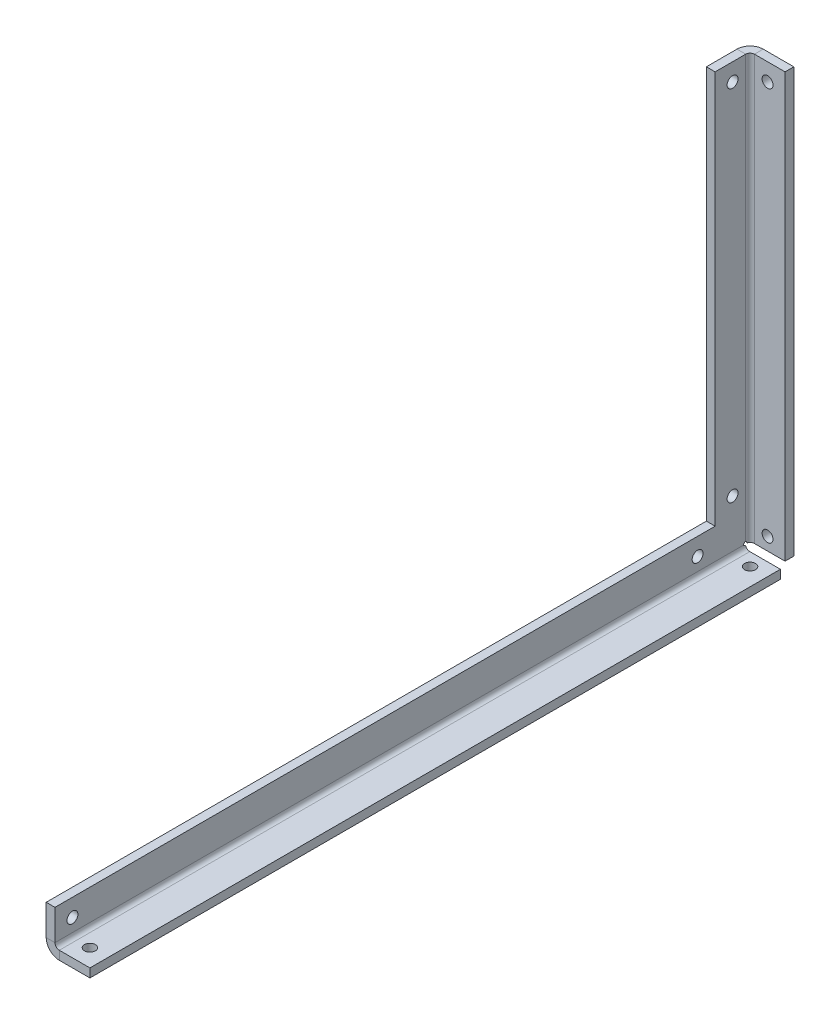
ISO-10303-21;
HEADER;
FILE_DESCRIPTION(('STEP AP214'),'2;1');
FILE_NAME('part.step','',(''),(''),'','','');
FILE_SCHEMA(('AUTOMOTIVE_DESIGN { 1 0 10303 214 1 1 1 1 }'));
ENDSEC;
DATA;
#1=APPLICATION_CONTEXT('core data for automotive mechanical design processes');
#2=APPLICATION_PROTOCOL_DEFINITION('international standard','automotive_design',2000,#1);
#3=PRODUCT_CONTEXT('',#1,'mechanical');
#4=PRODUCT('Part','Part','',(#3));
#5=PRODUCT_RELATED_PRODUCT_CATEGORY('part','',(#4));
#6=PRODUCT_DEFINITION_FORMATION('','',#4);
#7=PRODUCT_DEFINITION_CONTEXT('part definition',#1,'design');
#8=PRODUCT_DEFINITION('design','',#6,#7);
#9=PRODUCT_DEFINITION_SHAPE('','',#8);
#10=(LENGTH_UNIT() NAMED_UNIT(*) SI_UNIT(.MILLI.,.METRE.));
#11=(NAMED_UNIT(*) PLANE_ANGLE_UNIT() SI_UNIT($,.RADIAN.));
#12=(NAMED_UNIT(*) SI_UNIT($,.STERADIAN.) SOLID_ANGLE_UNIT());
#13=UNCERTAINTY_MEASURE_WITH_UNIT(LENGTH_MEASURE(1.E-05),#10,'distance_accuracy_value','');
#14=(GEOMETRIC_REPRESENTATION_CONTEXT(3) GLOBAL_UNCERTAINTY_ASSIGNED_CONTEXT((#13)) GLOBAL_UNIT_ASSIGNED_CONTEXT((#10,
#11,#12)) REPRESENTATION_CONTEXT('',''));
#15=CARTESIAN_POINT('',(0.,0.,0.));
#16=DIRECTION('',(0.,0.,1.));
#17=DIRECTION('',(1.,0.,0.));
#18=AXIS2_PLACEMENT_3D('',#15,#16,#17);
#19=CARTESIAN_POINT('',(2.,0.,0.));
#20=DIRECTION('',(1.,0.,0.));
#21=DIRECTION('',(0.,0.,-1.));
#22=AXIS2_PLACEMENT_3D('',#19,#20,#21);
#23=PLANE('',#22);
#24=CARTESIAN_POINT('',(2.,86.,-4.));
#25=DIRECTION('',(1.,0.,0.));
#26=DIRECTION('',(0.,0.,-1.));
#27=AXIS2_PLACEMENT_3D('',#24,#25,#26);
#28=CIRCLE('',#27,1.24999999999999);
#29=CARTESIAN_POINT('',(2.,86.,-5.24999999999999));
#30=VERTEX_POINT('',#29);
#31=EDGE_CURVE('E743',#30,#30,#28,.T.);
#32=ORIENTED_EDGE('',*,*,#31,.F.);
#33=EDGE_LOOP('',(#32));
#34=FACE_BOUND('',#33,.T.);
#35=CARTESIAN_POINT('',(2.,3.99999999999999,-4.));
#36=DIRECTION('',(1.,0.,0.));
#37=DIRECTION('',(0.,0.,-1.));
#38=AXIS2_PLACEMENT_3D('',#35,#36,#37);
#39=CIRCLE('',#38,1.24999999999999);
#40=CARTESIAN_POINT('',(2.,3.99999999999999,-5.24999999999999));
#41=VERTEX_POINT('',#40);
#42=EDGE_CURVE('E731',#41,#41,#39,.T.);
#43=ORIENTED_EDGE('',*,*,#42,.F.);
#44=EDGE_LOOP('',(#43));
#45=FACE_BOUND('',#44,.T.);
#46=CARTESIAN_POINT('',(2.,-4.,147.));
#47=DIRECTION('',(1.,0.,0.));
#48=DIRECTION('',(0.,0.,-1.));
#49=AXIS2_PLACEMENT_3D('',#46,#47,#48);
#50=CIRCLE('',#49,1.24999999999999);
#51=CARTESIAN_POINT('',(2.,-4.,145.75));
#52=VERTEX_POINT('',#51);
#53=EDGE_CURVE('E730',#52,#52,#50,.T.);
#54=ORIENTED_EDGE('',*,*,#53,.F.);
#55=EDGE_LOOP('',(#54));
#56=FACE_BOUND('',#55,.T.);
#57=CARTESIAN_POINT('',(2.,-4.,4.));
#58=DIRECTION('',(1.,0.,0.));
#59=DIRECTION('',(0.,0.,-1.));
#60=AXIS2_PLACEMENT_3D('',#57,#58,#59);
#61=CIRCLE('',#60,1.24999999999999);
#62=CARTESIAN_POINT('',(2.,-4.,2.75000000000002));
#63=VERTEX_POINT('',#62);
#64=EDGE_CURVE('E749',#63,#63,#61,.T.);
#65=ORIENTED_EDGE('',*,*,#64,.F.);
#66=EDGE_LOOP('',(#65));
#67=FACE_BOUND('',#66,.T.);
#68=CARTESIAN_POINT('',(2.,-7.00000000000002,-6.99999999999998));
#69=DIRECTION('',(1.,0.,0.));
#70=DIRECTION('',(0.,0.,-1.));
#71=AXIS2_PLACEMENT_3D('',#68,#69,#70);
#72=CIRCLE('',#71,0.5);
#73=CARTESIAN_POINT('',(1.99999999999999,-6.50000000000002,-7.00000000000001));
#74=VERTEX_POINT('',#73);
#75=CARTESIAN_POINT('',(2.,-7.00000000000002,-6.49999999999998));
#76=VERTEX_POINT('',#75);
#77=EDGE_CURVE('E686',#74,#76,#72,.T.);
#78=ORIENTED_EDGE('',*,*,#77,.F.);
#79=DIRECTION('',(0.,-1.,0.));
#80=VECTOR('',#79,1.);
#81=CARTESIAN_POINT('',(1.99999999999999,90.,-7.00000000000001));
#82=LINE('',#81,#80);
#83=CARTESIAN_POINT('',(1.99999999999999,90.,-7.00000000000001));
#84=VERTEX_POINT('',#83);
#85=EDGE_CURVE('E684',#84,#74,#82,.T.);
#86=ORIENTED_EDGE('',*,*,#85,.F.);
#87=DIRECTION('',(0.,0.,1.));
#88=VECTOR('',#87,1.);
#89=CARTESIAN_POINT('',(2.,90.,-10.));
#90=LINE('',#89,#88);
#91=CARTESIAN_POINT('',(2.,90.,0.));
#92=VERTEX_POINT('',#91);
#93=EDGE_CURVE('E660',#84,#92,#90,.T.);
#94=ORIENTED_EDGE('',*,*,#93,.T.);
#95=DIRECTION('',(0.,-1.,0.));
#96=VECTOR('',#95,1.);
#97=CARTESIAN_POINT('',(2.,0.,0.));
#98=LINE('',#97,#96);
#99=CARTESIAN_POINT('',(2.,0.,0.));
#100=VERTEX_POINT('',#99);
#101=EDGE_CURVE('E662',#92,#100,#98,.T.);
#102=ORIENTED_EDGE('',*,*,#101,.T.);
#103=DIRECTION('',(0.,0.,1.));
#104=VECTOR('',#103,1.);
#105=CARTESIAN_POINT('',(2.,0.,0.));
#106=LINE('',#105,#104);
#107=CARTESIAN_POINT('',(2.,0.,151.));
#108=VERTEX_POINT('',#107);
#109=EDGE_CURVE('E649',#100,#108,#106,.T.);
#110=ORIENTED_EDGE('',*,*,#109,.T.);
#111=DIRECTION('',(0.,-1.,0.));
#112=VECTOR('',#111,1.);
#113=CARTESIAN_POINT('',(2.,0.,151.));
#114=LINE('',#113,#112);
#115=CARTESIAN_POINT('',(2.,-7.00000000000002,151.));
#116=VERTEX_POINT('',#115);
#117=EDGE_CURVE('E657',#108,#116,#114,.T.);
#118=ORIENTED_EDGE('',*,*,#117,.T.);
#119=DIRECTION('',(0.,0.,1.));
#120=VECTOR('',#119,1.);
#121=CARTESIAN_POINT('',(2.,-7.00000000000002,-7.00000000000001));
#122=LINE('',#121,#120);
#123=EDGE_CURVE('E682',#76,#116,#122,.T.);
#124=ORIENTED_EDGE('',*,*,#123,.F.);
#125=EDGE_LOOP('',(#78,#86,#94,#102,#110,#118,#124));
#126=FACE_BOUND('',#125,.T.);
#127=ADVANCED_FACE('F124',(#34,#45,#56,#67,#126),#23,.T.);
#128=CARTESIAN_POINT('',(0.,0.,0.));
#129=DIRECTION('',(1.,0.,0.));
#130=DIRECTION('',(0.,0.,-1.));
#131=AXIS2_PLACEMENT_3D('',#128,#129,#130);
#132=PLANE('',#131);
#133=CARTESIAN_POINT('',(0.,86.,-4.));
#134=DIRECTION('',(1.,0.,0.));
#135=DIRECTION('',(0.,0.,-1.));
#136=AXIS2_PLACEMENT_3D('',#133,#134,#135);
#137=CIRCLE('',#136,1.24999999999999);
#138=CARTESIAN_POINT('',(0.,86.,-5.25));
#139=VERTEX_POINT('',#138);
#140=EDGE_CURVE('E738',#139,#139,#137,.T.);
#141=ORIENTED_EDGE('',*,*,#140,.T.);
#142=EDGE_LOOP('',(#141));
#143=FACE_BOUND('',#142,.T.);
#144=CARTESIAN_POINT('',(0.,3.99999999999999,-4.));
#145=DIRECTION('',(1.,0.,0.));
#146=DIRECTION('',(0.,0.,-1.));
#147=AXIS2_PLACEMENT_3D('',#144,#145,#146);
#148=CIRCLE('',#147,1.24999999999999);
#149=CARTESIAN_POINT('',(0.,3.99999999999999,-5.25));
#150=VERTEX_POINT('',#149);
#151=EDGE_CURVE('E728',#150,#150,#148,.T.);
#152=ORIENTED_EDGE('',*,*,#151,.T.);
#153=EDGE_LOOP('',(#152));
#154=FACE_BOUND('',#153,.T.);
#155=CARTESIAN_POINT('',(0.,-4.,147.));
#156=DIRECTION('',(1.,0.,0.));
#157=DIRECTION('',(0.,0.,-1.));
#158=AXIS2_PLACEMENT_3D('',#155,#156,#157);
#159=CIRCLE('',#158,1.24999999999999);
#160=CARTESIAN_POINT('',(0.,-4.,145.75));
#161=VERTEX_POINT('',#160);
#162=EDGE_CURVE('E735',#161,#161,#159,.T.);
#163=ORIENTED_EDGE('',*,*,#162,.T.);
#164=EDGE_LOOP('',(#163));
#165=FACE_BOUND('',#164,.T.);
#166=CARTESIAN_POINT('',(0.,-4.,4.));
#167=DIRECTION('',(1.,0.,0.));
#168=DIRECTION('',(0.,0.,-1.));
#169=AXIS2_PLACEMENT_3D('',#166,#167,#168);
#170=CIRCLE('',#169,1.24999999999999);
#171=CARTESIAN_POINT('',(0.,-4.,2.75000000000001));
#172=VERTEX_POINT('',#171);
#173=EDGE_CURVE('E311',#172,#172,#170,.T.);
#174=ORIENTED_EDGE('',*,*,#173,.T.);
#175=EDGE_LOOP('',(#174));
#176=FACE_BOUND('',#175,.T.);
#177=DIRECTION('',(0.,-1.,0.));
#178=VECTOR('',#177,1.);
#179=CARTESIAN_POINT('',(0.,90.,-7.00000000000001));
#180=LINE('',#179,#178);
#181=CARTESIAN_POINT('',(0.,90.,-7.00000000000001));
#182=VERTEX_POINT('',#181);
#183=CARTESIAN_POINT('',(0.,-6.50000000000002,-7.00000000000001));
#184=VERTEX_POINT('',#183);
#185=EDGE_CURVE('E683',#182,#184,#180,.T.);
#186=ORIENTED_EDGE('',*,*,#185,.T.);
#187=CARTESIAN_POINT('',(0.,-7.00000000000002,-6.99999999999998));
#188=DIRECTION('',(1.,0.,0.));
#189=DIRECTION('',(0.,0.,-1.));
#190=AXIS2_PLACEMENT_3D('',#187,#188,#189);
#191=CIRCLE('',#190,0.5);
#192=CARTESIAN_POINT('',(0.,-7.00000000000002,-6.49999999999998));
#193=VERTEX_POINT('',#192);
#194=EDGE_CURVE('E141',#184,#193,#191,.T.);
#195=ORIENTED_EDGE('',*,*,#194,.T.);
#196=DIRECTION('',(0.,0.,1.));
#197=VECTOR('',#196,1.);
#198=CARTESIAN_POINT('',(0.,-7.00000000000002,-7.00000000000001));
#199=LINE('',#198,#197);
#200=CARTESIAN_POINT('',(0.,-7.00000000000002,151.));
#201=VERTEX_POINT('',#200);
#202=EDGE_CURVE('E134',#193,#201,#199,.T.);
#203=ORIENTED_EDGE('',*,*,#202,.T.);
#204=DIRECTION('',(0.,-1.,0.));
#205=VECTOR('',#204,1.);
#206=CARTESIAN_POINT('',(0.,0.,151.));
#207=LINE('',#206,#205);
#208=CARTESIAN_POINT('',(0.,0.,151.));
#209=VERTEX_POINT('',#208);
#210=EDGE_CURVE('E149',#209,#201,#207,.T.);
#211=ORIENTED_EDGE('',*,*,#210,.F.);
#212=DIRECTION('',(0.,0.,1.));
#213=VECTOR('',#212,1.);
#214=CARTESIAN_POINT('',(0.,0.,0.));
#215=LINE('',#214,#213);
#216=CARTESIAN_POINT('',(0.,0.,0.));
#217=VERTEX_POINT('',#216);
#218=EDGE_CURVE('E665',#217,#209,#215,.T.);
#219=ORIENTED_EDGE('',*,*,#218,.F.);
#220=DIRECTION('',(0.,-1.,0.));
#221=VECTOR('',#220,1.);
#222=CARTESIAN_POINT('',(0.,0.,0.));
#223=LINE('',#222,#221);
#224=CARTESIAN_POINT('',(0.,90.,0.));
#225=VERTEX_POINT('',#224);
#226=EDGE_CURVE('E658',#225,#217,#223,.T.);
#227=ORIENTED_EDGE('',*,*,#226,.F.);
#228=DIRECTION('',(0.,0.,1.));
#229=VECTOR('',#228,1.);
#230=CARTESIAN_POINT('',(0.,90.,-10.));
#231=LINE('',#230,#229);
#232=EDGE_CURVE('E669',#182,#225,#231,.T.);
#233=ORIENTED_EDGE('',*,*,#232,.F.);
#234=EDGE_LOOP('',(#186,#195,#203,#211,#219,#227,#233));
#235=FACE_BOUND('',#234,.T.);
#236=ADVANCED_FACE('F755',(#143,#154,#165,#176,#235),#132,.F.);
#237=CARTESIAN_POINT('',(2.,0.,151.));
#238=DIRECTION('',(0.,0.,-1.));
#239=DIRECTION('',(-1.,0.,0.));
#240=AXIS2_PLACEMENT_3D('',#237,#238,#239);
#241=PLANE('',#240);
#242=DIRECTION('',(-1.,0.,0.));
#243=VECTOR('',#242,1.);
#244=CARTESIAN_POINT('',(2.,-7.00000000000002,151.));
#245=LINE('',#244,#243);
#246=EDGE_CURVE('E709',#116,#201,#245,.T.);
#247=ORIENTED_EDGE('',*,*,#246,.F.);
#248=ORIENTED_EDGE('',*,*,#117,.F.);
#249=DIRECTION('',(-1.,0.,0.));
#250=VECTOR('',#249,1.);
#251=CARTESIAN_POINT('',(2.,0.,151.));
#252=LINE('',#251,#250);
#253=EDGE_CURVE('E677',#108,#209,#252,.T.);
#254=ORIENTED_EDGE('',*,*,#253,.T.);
#255=ORIENTED_EDGE('',*,*,#210,.T.);
#256=EDGE_LOOP('',(#247,#248,#254,#255));
#257=FACE_BOUND('',#256,.T.);
#258=ADVANCED_FACE('F776',(#257),#241,.F.);
#259=CARTESIAN_POINT('',(2.,90.,-10.));
#260=DIRECTION('',(0.,-1.,0.));
#261=DIRECTION('',(0.,0.,-1.));
#262=AXIS2_PLACEMENT_3D('',#259,#260,#261);
#263=PLANE('',#262);
#264=DIRECTION('',(-1.,0.,0.));
#265=VECTOR('',#264,1.);
#266=CARTESIAN_POINT('',(1.99999999999999,90.,-7.00000000000001));
#267=LINE('',#266,#265);
#268=EDGE_CURVE('E679',#84,#182,#267,.T.);
#269=ORIENTED_EDGE('',*,*,#268,.T.);
#270=ORIENTED_EDGE('',*,*,#232,.T.);
#271=DIRECTION('',(-1.,0.,0.));
#272=VECTOR('',#271,1.);
#273=CARTESIAN_POINT('',(2.,90.,0.));
#274=LINE('',#273,#272);
#275=EDGE_CURVE('E674',#92,#225,#274,.T.);
#276=ORIENTED_EDGE('',*,*,#275,.F.);
#277=ORIENTED_EDGE('',*,*,#93,.F.);
#278=EDGE_LOOP('',(#269,#270,#276,#277));
#279=FACE_BOUND('',#278,.T.);
#280=ADVANCED_FACE('F1113',(#279),#263,.F.);
#281=CARTESIAN_POINT('',(2.,0.,0.));
#282=DIRECTION('',(0.,-1.,0.));
#283=DIRECTION('',(0.,0.,-1.));
#284=AXIS2_PLACEMENT_3D('',#281,#282,#283);
#285=PLANE('',#284);
#286=ORIENTED_EDGE('',*,*,#218,.T.);
#287=ORIENTED_EDGE('',*,*,#253,.F.);
#288=ORIENTED_EDGE('',*,*,#109,.F.);
#289=DIRECTION('',(-1.,0.,0.));
#290=VECTOR('',#289,1.);
#291=CARTESIAN_POINT('',(2.,0.,0.));
#292=LINE('',#291,#290);
#293=EDGE_CURVE('E664',#100,#217,#292,.T.);
#294=ORIENTED_EDGE('',*,*,#293,.T.);
#295=EDGE_LOOP('',(#286,#287,#288,#294));
#296=FACE_BOUND('',#295,.T.);
#297=ADVANCED_FACE('F1108',(#296),#285,.F.);
#298=CARTESIAN_POINT('',(2.,0.,0.));
#299=DIRECTION('',(0.,0.,-1.));
#300=DIRECTION('',(-1.,0.,0.));
#301=AXIS2_PLACEMENT_3D('',#298,#299,#300);
#302=PLANE('',#301);
#303=ORIENTED_EDGE('',*,*,#226,.T.);
#304=ORIENTED_EDGE('',*,*,#293,.F.);
#305=ORIENTED_EDGE('',*,*,#101,.F.);
#306=ORIENTED_EDGE('',*,*,#275,.T.);
#307=EDGE_LOOP('',(#303,#304,#305,#306));
#308=FACE_BOUND('',#307,.T.);
#309=ADVANCED_FACE('F1021',(#308),#302,.F.);
#310=CARTESIAN_POINT('',(2.,-7.00000000000002,-6.99999999999998));
#311=DIRECTION('',(1.,0.,0.));
#312=DIRECTION('',(0.,0.,-1.));
#313=AXIS2_PLACEMENT_3D('',#310,#311,#312);
#314=CYLINDRICAL_SURFACE('',#313,0.5);
#315=CARTESIAN_POINT('',(0.,-7.00000000000002,-6.49999999999998));
#316=CARTESIAN_POINT('',(2.,-7.00000000000002,-6.49999999999998));
#317=B_SPLINE_CURVE_WITH_KNOTS('',1,(#315,#316),.UNSPECIFIED.,.F.,.F.,(2,2),(0.,1.),.UNSPECIFIED.);
#318=EDGE_CURVE('E14',#193,#76,#317,.T.);
#319=ORIENTED_EDGE('',*,*,#318,.F.);
#320=ORIENTED_EDGE('',*,*,#194,.F.);
#321=CARTESIAN_POINT('',(1.99999999999999,-6.50000000000002,-7.00000000000001));
#322=CARTESIAN_POINT('',(0.,-6.50000000000002,-7.00000000000001));
#323=B_SPLINE_CURVE_WITH_KNOTS('',1,(#321,#322),.UNSPECIFIED.,.F.,.F.,(2,2),(0.,1.),.UNSPECIFIED.);
#324=EDGE_CURVE('E645',#74,#184,#323,.T.);
#325=ORIENTED_EDGE('',*,*,#324,.F.);
#326=ORIENTED_EDGE('',*,*,#77,.T.);
#327=EDGE_LOOP('',(#319,#320,#325,#326));
#328=FACE_BOUND('',#327,.T.);
#329=ADVANCED_FACE('F126',(#328),#314,.F.);
#330=CARTESIAN_POINT('',(0.,-6.50000000000002,-7.00000000000001));
#331=CARTESIAN_POINT('',(0.,-6.54881683809607,-7.17678140890549));
#332=CARTESIAN_POINT('',(0.0156647341426923,-6.59762977131069,-7.35354587749687));
#333=CARTESIAN_POINT('',(0.0467530567731275,-6.64644660940675,-7.52757226265335));
#334=CARTESIAN_POINT('',(1.99999999999999,-6.50000000000002,-7.00000000000001));
#335=CARTESIAN_POINT('',(1.99999999999999,-6.54881637998907,-7.05892658331775));
#336=CARTESIAN_POINT('',(2.00522167529391,-6.5976302294177,-7.11784917019848));
#337=CARTESIAN_POINT('',(2.01558435225771,-6.64644660940675,-7.17585742088445));
#338=B_SPLINE_SURFACE_WITH_KNOTS('',1,3,((#330,#331,#332,#333),(#334,#335,#336,#337)),
.UNSPECIFIED.,.F.,.F.,.F.,(2,2),(4,4),(0.,1.),(0.,1.),.UNSPECIFIED.);
#339=CARTESIAN_POINT('',(0.,-6.50000000000002,-7.00000000000001));
#340=CARTESIAN_POINT('',(0.,-6.54881683809607,-7.17678140890549));
#341=CARTESIAN_POINT('',(0.0156647341426923,-6.59762977131069,-7.35354587749687));
#342=CARTESIAN_POINT('',(0.0467530567731275,-6.64644660940675,-7.52757226265335));
#343=B_SPLINE_CURVE_WITH_KNOTS('',3,(#339,#340,#341,#342),.UNSPECIFIED.,.F.,.F.,(4,4),(0.,1.),.UNSPECIFIED.);
#344=CARTESIAN_POINT('',(0.0467528316174014,-6.64644625585265,-7.5275710022738));
#345=VERTEX_POINT('',#344);
#346=EDGE_CURVE('E471',#184,#345,#343,.T.);
#347=CARTESIAN_POINT('',(0.0467530567731275,-6.64644660940675,-7.52757226265335));
#348=CARTESIAN_POINT('',(2.01558435225771,-6.64644660940675,-7.17585742088445));
#349=B_SPLINE_CURVE_WITH_KNOTS('',1,(#347,#348),.UNSPECIFIED.,.F.,.F.,(2,2),(0.,1.),.UNSPECIFIED.);
#350=CARTESIAN_POINT('',(2.01558435225771,-6.64644660940675,-7.17585742088445));
#351=VERTEX_POINT('',#350);
#352=EDGE_CURVE('E635',#345,#351,#349,.T.);
#353=CARTESIAN_POINT('',(2.01558435225771,-6.64644660940675,-7.17585742088445));
#354=CARTESIAN_POINT('',(2.00522167529391,-6.5976302294177,-7.11784917019848));
#355=CARTESIAN_POINT('',(1.99999999999999,-6.54881637998907,-7.05892658331775));
#356=CARTESIAN_POINT('',(1.99999999999999,-6.50000000000002,-7.00000000000001));
#357=B_SPLINE_CURVE_WITH_KNOTS('',3,(#353,#354,#355,#356),.UNSPECIFIED.,.F.,.F.,(4,4),(0.,1.),.UNSPECIFIED.);
#358=EDGE_CURVE('E520',#74,#351,#357,.F.);
#359=ORIENTED_EDGE('',*,*,#324,.T.);
#360=ORIENTED_EDGE('',*,*,#346,.T.);
#361=ORIENTED_EDGE('',*,*,#352,.T.);
#362=ORIENTED_EDGE('',*,*,#358,.F.);
#363=EDGE_LOOP('',(#359,#360,#361,#362));
#364=FACE_BOUND('',#363,.T.);
#365=ADVANCED_FACE('F592',(#364),#338,.F.);
#366=CARTESIAN_POINT('',(0.0467530567731275,-6.64644660940675,-7.52757226265335));
#367=CARTESIAN_POINT('',(0.0725070259573776,-6.74407861551232,-7.67173797444953));
#368=CARTESIAN_POINT('',(0.108834875722219,-6.84170782211463,-7.81400936330384));
#369=CARTESIAN_POINT('',(0.155350365492801,-6.9393398282202,-7.95287378854603));
#370=CARTESIAN_POINT('',(2.01558435225771,-6.64644660940675,-7.17585742088445));
#371=CARTESIAN_POINT('',(2.02416895067863,-6.74407795618475,-7.22391233362366));
#372=CARTESIAN_POINT('',(2.03627839661673,-6.8417084814422,-7.27133676702726));
#373=CARTESIAN_POINT('',(2.05178345516426,-6.9393398282202,-7.31762459618202));
#374=B_SPLINE_SURFACE_WITH_KNOTS('',1,3,((#366,#367,#368,#369),(#370,#371,#372,#373)),
.UNSPECIFIED.,.F.,.F.,.F.,(2,2),(4,4),(0.,1.),(0.,1.),.UNSPECIFIED.);
#375=CARTESIAN_POINT('',(0.0467530567731275,-6.64644660940675,-7.52757226265335));
#376=CARTESIAN_POINT('',(0.0725070259573776,-6.74407861551232,-7.67173797444953));
#377=CARTESIAN_POINT('',(0.108834875722219,-6.84170782211463,-7.81400936330384));
#378=CARTESIAN_POINT('',(0.155350365492801,-6.9393398282202,-7.95287378854603));
#379=B_SPLINE_CURVE_WITH_KNOTS('',3,(#375,#376,#377,#378),.UNSPECIFIED.,.F.,.F.,(4,4),(0.,1.),.UNSPECIFIED.);
#380=CARTESIAN_POINT('',(0.155350365492801,-6.9393398282202,-7.95287378854603));
#381=VERTEX_POINT('',#380);
#382=EDGE_CURVE('E524',#345,#381,#379,.T.);
#383=CARTESIAN_POINT('',(0.155350365492801,-6.9393398282202,-7.95287378854603));
#384=CARTESIAN_POINT('',(2.05178345516426,-6.9393398282202,-7.31762459618202));
#385=B_SPLINE_CURVE_WITH_KNOTS('',1,(#383,#384),.UNSPECIFIED.,.F.,.F.,(2,2),(0.,1.),.UNSPECIFIED.);
#386=CARTESIAN_POINT('',(2.05178345516426,-6.9393398282202,-7.31762459618202));
#387=VERTEX_POINT('',#386);
#388=EDGE_CURVE('E515',#381,#387,#385,.T.);
#389=CARTESIAN_POINT('',(2.05178345516426,-6.9393398282202,-7.31762459618202));
#390=CARTESIAN_POINT('',(2.03627839661673,-6.8417084814422,-7.27133676702726));
#391=CARTESIAN_POINT('',(2.02416895067863,-6.74407795618475,-7.22391233362366));
#392=CARTESIAN_POINT('',(2.01558435225771,-6.64644660940675,-7.17585742088445));
#393=B_SPLINE_CURVE_WITH_KNOTS('',3,(#389,#390,#391,#392),.UNSPECIFIED.,.F.,.F.,(4,4),(0.,1.),.UNSPECIFIED.);
#394=EDGE_CURVE('E796',#351,#387,#393,.F.);
#395=ORIENTED_EDGE('',*,*,#352,.F.);
#396=ORIENTED_EDGE('',*,*,#382,.T.);
#397=ORIENTED_EDGE('',*,*,#388,.T.);
#398=ORIENTED_EDGE('',*,*,#394,.F.);
#399=EDGE_LOOP('',(#395,#396,#397,#398));
#400=FACE_BOUND('',#399,.T.);
#401=ADVANCED_FACE('F603',(#400),#374,.F.);
#402=CARTESIAN_POINT('',(2.99999999999999,-6.9393398282202,-7.00000000000001));
#403=DIRECTION('',(0.,1.,0.));
#404=DIRECTION('',(0.,0.,1.));
#405=AXIS2_PLACEMENT_3D('',#402,#403,#404);
#406=PLANE('',#405);
#407=ORIENTED_EDGE('',*,*,#388,.F.);
#408=CARTESIAN_POINT('',(2.99999999999999,-6.9393398282202,-7.00000000000001));
#409=DIRECTION('',(0.,1.,0.));
#410=DIRECTION('',(0.,0.,1.));
#411=AXIS2_PLACEMENT_3D('',#408,#409,#410);
#412=CIRCLE('',#411,3.);
#413=CARTESIAN_POINT('',(3.00000000000001,-6.9393398282202,-9.99999999999998));
#414=VERTEX_POINT('',#413);
#415=EDGE_CURVE('E521',#381,#414,#412,.F.);
#416=ORIENTED_EDGE('',*,*,#415,.T.);
#417=DIRECTION('',(0.,0.,1.));
#418=VECTOR('',#417,1.);
#419=CARTESIAN_POINT('',(3.00000000000001,-6.9393398282202,-9.99999999999998));
#420=LINE('',#419,#418);
#421=CARTESIAN_POINT('',(2.99999999999998,-6.9393398282202,-7.99999999999998));
#422=VERTEX_POINT('',#421);
#423=EDGE_CURVE('E494',#414,#422,#420,.T.);
#424=ORIENTED_EDGE('',*,*,#423,.T.);
#425=CARTESIAN_POINT('',(2.99999999999999,-6.9393398282202,-7.00000000000001));
#426=DIRECTION('',(0.,-1.,0.));
#427=DIRECTION('',(0.,0.,1.));
#428=AXIS2_PLACEMENT_3D('',#425,#426,#427);
#429=CIRCLE('',#428,1.);
#430=EDGE_CURVE('E516',#387,#422,#429,.T.);
#431=ORIENTED_EDGE('',*,*,#430,.F.);
#432=EDGE_LOOP('',(#407,#416,#424,#431));
#433=FACE_BOUND('',#432,.T.);
#434=ADVANCED_FACE('F805',(#433),#406,.F.);
#435=CARTESIAN_POINT('',(2.99999999999999,90.,-7.00000000000001));
#436=DIRECTION('',(0.,-1.,0.));
#437=DIRECTION('',(0.,0.,-1.));
#438=AXIS2_PLACEMENT_3D('',#435,#436,#437);
#439=PLANE('',#438);
#440=DIRECTION('',(0.,0.,-1.));
#441=VECTOR('',#440,1.);
#442=CARTESIAN_POINT('',(3.00000000000002,90.,-7.99999999999998));
#443=LINE('',#442,#441);
#444=CARTESIAN_POINT('',(2.99999999999999,90.,-8.00000000000001));
#445=VERTEX_POINT('',#444);
#446=CARTESIAN_POINT('',(3.00000000000002,90.,-9.99999999999998));
#447=VERTEX_POINT('',#446);
#448=EDGE_CURVE('E502',#445,#447,#443,.T.);
#449=ORIENTED_EDGE('',*,*,#448,.T.);
#450=CARTESIAN_POINT('',(2.99999999999999,90.,-7.00000000000001));
#451=DIRECTION('',(0.,1.,0.));
#452=DIRECTION('',(0.,0.,1.));
#453=AXIS2_PLACEMENT_3D('',#450,#451,#452);
#454=CIRCLE('',#453,3.);
#455=EDGE_CURVE('E517',#447,#182,#454,.T.);
#456=ORIENTED_EDGE('',*,*,#455,.T.);
#457=ORIENTED_EDGE('',*,*,#268,.F.);
#458=CARTESIAN_POINT('',(2.99999999999999,90.,-7.00000000000001));
#459=DIRECTION('',(0.,1.,0.));
#460=DIRECTION('',(0.,0.,1.));
#461=AXIS2_PLACEMENT_3D('',#458,#459,#460);
#462=CIRCLE('',#461,1.);
#463=EDGE_CURVE('E512',#445,#84,#462,.T.);
#464=ORIENTED_EDGE('',*,*,#463,.F.);
#465=EDGE_LOOP('',(#449,#456,#457,#464));
#466=FACE_BOUND('',#465,.T.);
#467=ADVANCED_FACE('F544',(#466),#439,.F.);
#468=CARTESIAN_POINT('',(2.99999999999999,-55.2608509947844,-7.00000000000001));
#469=DIRECTION('',(0.,1.,0.));
#470=DIRECTION('',(0.,0.,1.));
#471=AXIS2_PLACEMENT_3D('',#468,#469,#470);
#472=CYLINDRICAL_SURFACE('',#471,1.);
#473=ORIENTED_EDGE('',*,*,#463,.T.);
#474=ORIENTED_EDGE('',*,*,#85,.T.);
#475=ORIENTED_EDGE('',*,*,#358,.T.);
#476=ORIENTED_EDGE('',*,*,#394,.T.);
#477=ORIENTED_EDGE('',*,*,#430,.T.);
#478=DIRECTION('',(0.,1.,0.));
#479=VECTOR('',#478,1.);
#480=CARTESIAN_POINT('',(3.00000000000001,-10.,-7.99999999999998));
#481=LINE('',#480,#479);
#482=EDGE_CURVE('E507',#422,#445,#481,.T.);
#483=ORIENTED_EDGE('',*,*,#482,.T.);
#484=EDGE_LOOP('',(#473,#474,#475,#476,#477,#483));
#485=FACE_BOUND('',#484,.T.);
#486=ADVANCED_FACE('F533',(#485),#472,.F.);
#487=CARTESIAN_POINT('',(2.99999999999999,-55.2608509947844,-7.00000000000001));
#488=DIRECTION('',(0.,1.,0.));
#489=DIRECTION('',(0.,0.,1.));
#490=AXIS2_PLACEMENT_3D('',#487,#488,#489);
#491=CYLINDRICAL_SURFACE('',#490,3.);
#492=ORIENTED_EDGE('',*,*,#455,.F.);
#493=DIRECTION('',(0.,-1.,0.));
#494=VECTOR('',#493,1.);
#495=CARTESIAN_POINT('',(3.00000000000001,-10.,-9.99999999999998));
#496=LINE('',#495,#494);
#497=EDGE_CURVE('E497',#447,#414,#496,.T.);
#498=ORIENTED_EDGE('',*,*,#497,.T.);
#499=ORIENTED_EDGE('',*,*,#415,.F.);
#500=ORIENTED_EDGE('',*,*,#382,.F.);
#501=ORIENTED_EDGE('',*,*,#346,.F.);
#502=ORIENTED_EDGE('',*,*,#185,.F.);
#503=EDGE_LOOP('',(#492,#498,#499,#500,#501,#502));
#504=FACE_BOUND('',#503,.T.);
#505=ADVANCED_FACE('F543',(#504),#491,.T.);
#506=CARTESIAN_POINT('',(10.,-10.,-10.));
#507=DIRECTION('',(-1.,0.,0.));
#508=DIRECTION('',(0.,0.,1.));
#509=AXIS2_PLACEMENT_3D('',#506,#507,#508);
#510=PLANE('',#509);
#511=DIRECTION('',(0.,0.,-1.));
#512=VECTOR('',#511,1.);
#513=CARTESIAN_POINT('',(10.,-6.9393398282202,-8.00000000000001));
#514=LINE('',#513,#512);
#515=CARTESIAN_POINT('',(10.,-6.9393398282202,-10.));
#516=VERTEX_POINT('',#515);
#517=CARTESIAN_POINT('',(10.,-6.9393398282202,-8.00000000000001));
#518=VERTEX_POINT('',#517);
#519=EDGE_CURVE('E477',#516,#518,#514,.F.);
#520=ORIENTED_EDGE('',*,*,#519,.F.);
#521=DIRECTION('',(0.,-1.,0.));
#522=VECTOR('',#521,1.);
#523=CARTESIAN_POINT('',(10.,0.,-10.));
#524=LINE('',#523,#522);
#525=CARTESIAN_POINT('',(10.,90.,-10.));
#526=VERTEX_POINT('',#525);
#527=EDGE_CURVE('E472',#526,#516,#524,.T.);
#528=ORIENTED_EDGE('',*,*,#527,.F.);
#529=DIRECTION('',(0.,0.,1.));
#530=VECTOR('',#529,1.);
#531=CARTESIAN_POINT('',(10.,90.,-10.));
#532=LINE('',#531,#530);
#533=CARTESIAN_POINT('',(10.,90.,-8.00000000000001));
#534=VERTEX_POINT('',#533);
#535=EDGE_CURVE('E491',#526,#534,#532,.T.);
#536=ORIENTED_EDGE('',*,*,#535,.T.);
#537=DIRECTION('',(0.,1.,0.));
#538=VECTOR('',#537,1.);
#539=CARTESIAN_POINT('',(10.,-10.,-8.00000000000001));
#540=LINE('',#539,#538);
#541=EDGE_CURVE('E486',#534,#518,#540,.F.);
#542=ORIENTED_EDGE('',*,*,#541,.T.);
#543=EDGE_LOOP('',(#520,#528,#536,#542));
#544=FACE_BOUND('',#543,.T.);
#545=ADVANCED_FACE('F825',(#544),#510,.F.);
#546=CARTESIAN_POINT('',(0.,0.,-7.99999999999998));
#547=DIRECTION('',(0.,0.,1.));
#548=DIRECTION('',(1.,0.,0.));
#549=AXIS2_PLACEMENT_3D('',#546,#547,#548);
#550=PLANE('',#549);
#551=CARTESIAN_POINT('',(6.00000000000001,86.,-7.99999999999998));
#552=DIRECTION('',(0.,0.,1.));
#553=DIRECTION('',(1.,0.,0.));
#554=AXIS2_PLACEMENT_3D('',#551,#552,#553);
#555=CIRCLE('',#554,1.24999999999999);
#556=CARTESIAN_POINT('',(7.24999999999999,86.,-7.99999999999998));
#557=VERTEX_POINT('',#556);
#558=EDGE_CURVE('E897',#557,#557,#555,.T.);
#559=ORIENTED_EDGE('',*,*,#558,.F.);
#560=EDGE_LOOP('',(#559));
#561=FACE_BOUND('',#560,.T.);
#562=CARTESIAN_POINT('',(6.00000000000001,-4.,-7.99999999999998));
#563=DIRECTION('',(0.,0.,1.));
#564=DIRECTION('',(1.,0.,0.));
#565=AXIS2_PLACEMENT_3D('',#562,#563,#564);
#566=CIRCLE('',#565,1.24999999999999);
#567=CARTESIAN_POINT('',(7.24999999999999,-4.,-7.99999999999998));
#568=VERTEX_POINT('',#567);
#569=EDGE_CURVE('E850',#568,#568,#566,.T.);
#570=ORIENTED_EDGE('',*,*,#569,.F.);
#571=EDGE_LOOP('',(#570));
#572=FACE_BOUND('',#571,.T.);
#573=ORIENTED_EDGE('',*,*,#482,.F.);
#574=DIRECTION('',(1.,0.,0.));
#575=VECTOR('',#574,1.);
#576=CARTESIAN_POINT('',(0.,-6.9393398282202,-7.99999999999998));
#577=LINE('',#576,#575);
#578=EDGE_CURVE('E481',#422,#518,#577,.T.);
#579=ORIENTED_EDGE('',*,*,#578,.T.);
#580=ORIENTED_EDGE('',*,*,#541,.F.);
#581=DIRECTION('',(-1.,0.,0.));
#582=VECTOR('',#581,1.);
#583=CARTESIAN_POINT('',(10.,90.,-8.00000000000001));
#584=LINE('',#583,#582);
#585=EDGE_CURVE('E464',#445,#534,#584,.F.);
#586=ORIENTED_EDGE('',*,*,#585,.F.);
#587=EDGE_LOOP('',(#573,#579,#580,#586));
#588=FACE_BOUND('',#587,.T.);
#589=ADVANCED_FACE('F823',(#561,#572,#588),#550,.T.);
#590=CARTESIAN_POINT('',(2.00000000000001,-6.9393398282202,-7.99999999999998));
#591=DIRECTION('',(0.,-1.,0.));
#592=DIRECTION('',(1.,0.,0.));
#593=AXIS2_PLACEMENT_3D('',#590,#591,#592);
#594=PLANE('',#593);
#595=ORIENTED_EDGE('',*,*,#423,.F.);
#596=DIRECTION('',(-1.,0.,0.));
#597=VECTOR('',#596,1.);
#598=CARTESIAN_POINT('',(2.00000000000001,-6.9393398282202,-9.99999999999998));
#599=LINE('',#598,#597);
#600=EDGE_CURVE('E479',#414,#516,#599,.F.);
#601=ORIENTED_EDGE('',*,*,#600,.T.);
#602=ORIENTED_EDGE('',*,*,#519,.T.);
#603=ORIENTED_EDGE('',*,*,#578,.F.);
#604=EDGE_LOOP('',(#595,#601,#602,#603));
#605=FACE_BOUND('',#604,.T.);
#606=ADVANCED_FACE('F810',(#605),#594,.T.);
#607=CARTESIAN_POINT('',(0.,0.,-9.99999999999998));
#608=DIRECTION('',(0.,0.,1.));
#609=DIRECTION('',(1.,0.,0.));
#610=AXIS2_PLACEMENT_3D('',#607,#608,#609);
#611=PLANE('',#610);
#612=CARTESIAN_POINT('',(6.00000000000001,86.,-9.99999999999998));
#613=DIRECTION('',(0.,0.,1.));
#614=DIRECTION('',(1.,0.,0.));
#615=AXIS2_PLACEMENT_3D('',#612,#613,#614);
#616=CIRCLE('',#615,1.24999999999999);
#617=CARTESIAN_POINT('',(7.25,86.,-9.99999999999998));
#618=VERTEX_POINT('',#617);
#619=EDGE_CURVE('E844',#618,#618,#616,.T.);
#620=ORIENTED_EDGE('',*,*,#619,.T.);
#621=EDGE_LOOP('',(#620));
#622=FACE_BOUND('',#621,.T.);
#623=CARTESIAN_POINT('',(6.00000000000001,-4.,-10.));
#624=DIRECTION('',(0.,0.,1.));
#625=DIRECTION('',(1.,0.,0.));
#626=AXIS2_PLACEMENT_3D('',#623,#624,#625);
#627=CIRCLE('',#626,1.24999999999999);
#628=CARTESIAN_POINT('',(7.25,-4.,-10.));
#629=VERTEX_POINT('',#628);
#630=EDGE_CURVE('E847',#629,#629,#627,.T.);
#631=ORIENTED_EDGE('',*,*,#630,.T.);
#632=EDGE_LOOP('',(#631));
#633=FACE_BOUND('',#632,.T.);
#634=ORIENTED_EDGE('',*,*,#600,.F.);
#635=ORIENTED_EDGE('',*,*,#497,.F.);
#636=DIRECTION('',(1.,0.,0.));
#637=VECTOR('',#636,1.);
#638=CARTESIAN_POINT('',(0.,90.,-9.99999999999998));
#639=LINE('',#638,#637);
#640=EDGE_CURVE('E475',#447,#526,#639,.T.);
#641=ORIENTED_EDGE('',*,*,#640,.T.);
#642=ORIENTED_EDGE('',*,*,#527,.T.);
#643=EDGE_LOOP('',(#634,#635,#641,#642));
#644=FACE_BOUND('',#643,.T.);
#645=ADVANCED_FACE('F815',(#622,#633,#644),#611,.F.);
#646=CARTESIAN_POINT('',(10.,90.,-10.));
#647=DIRECTION('',(0.,-1.,0.));
#648=DIRECTION('',(0.,0.,-1.));
#649=AXIS2_PLACEMENT_3D('',#646,#647,#648);
#650=PLANE('',#649);
#651=ORIENTED_EDGE('',*,*,#448,.F.);
#652=ORIENTED_EDGE('',*,*,#585,.T.);
#653=ORIENTED_EDGE('',*,*,#535,.F.);
#654=ORIENTED_EDGE('',*,*,#640,.F.);
#655=EDGE_LOOP('',(#651,#652,#653,#654));
#656=FACE_BOUND('',#655,.T.);
#657=ADVANCED_FACE('F546',(#656),#650,.F.);
#658=CARTESIAN_POINT('',(3.,-7.00000000000002,-6.9393398282202));
#659=DIRECTION('',(0.,0.,1.));
#660=DIRECTION('',(1.,0.,0.));
#661=AXIS2_PLACEMENT_3D('',#658,#659,#660);
#662=PLANE('',#661);
#663=DIRECTION('',(0.,-1.,0.));
#664=VECTOR('',#663,1.);
#665=CARTESIAN_POINT('',(3.,-8.00000000000002,-6.9393398282202));
#666=LINE('',#665,#664);
#667=CARTESIAN_POINT('',(3.,-8.00000000000002,-6.9393398282202));
#668=VERTEX_POINT('',#667);
#669=CARTESIAN_POINT('',(3.00000000000001,-10.,-6.9393398282202));
#670=VERTEX_POINT('',#669);
#671=EDGE_CURVE('E301',#668,#670,#666,.T.);
#672=ORIENTED_EDGE('',*,*,#671,.T.);
#673=CARTESIAN_POINT('',(3.,-7.00000000000002,-6.9393398282202));
#674=DIRECTION('',(0.,0.,-1.));
#675=DIRECTION('',(-1.,0.,0.));
#676=AXIS2_PLACEMENT_3D('',#673,#674,#675);
#677=CIRCLE('',#676,3.);
#678=CARTESIAN_POINT('',(0.15535036549284,-7.95287378854617,-6.9393398282202));
#679=VERTEX_POINT('',#678);
#680=EDGE_CURVE('E285',#670,#679,#677,.T.);
#681=ORIENTED_EDGE('',*,*,#680,.T.);
#682=CARTESIAN_POINT('',(2.05178345516428,-7.31762459618207,-6.9393398282202));
#683=CARTESIAN_POINT('',(0.15535036549284,-7.95287378854617,-6.9393398282202));
#684=B_SPLINE_CURVE_WITH_KNOTS('',1,(#682,#683),.UNSPECIFIED.,.F.,.F.,(2,2),(0.,1.),.UNSPECIFIED.);
#685=CARTESIAN_POINT('',(2.05178345516428,-7.31762459618207,-6.9393398282202));
#686=VERTEX_POINT('',#685);
#687=EDGE_CURVE('E452',#679,#686,#684,.F.);
#688=ORIENTED_EDGE('',*,*,#687,.T.);
#689=CARTESIAN_POINT('',(3.,-7.00000000000002,-6.9393398282202));
#690=DIRECTION('',(0.,0.,-1.));
#691=DIRECTION('',(1.,0.,0.));
#692=AXIS2_PLACEMENT_3D('',#689,#690,#691);
#693=CIRCLE('',#692,1.);
#694=EDGE_CURVE('E321',#668,#686,#693,.T.);
#695=ORIENTED_EDGE('',*,*,#694,.F.);
#696=EDGE_LOOP('',(#672,#681,#688,#695));
#697=FACE_BOUND('',#696,.T.);
#698=ADVANCED_FACE('F409',(#697),#662,.F.);
#699=CARTESIAN_POINT('',(0.15535036549284,-7.95287378854617,-6.9393398282202));
#700=CARTESIAN_POINT('',(0.10883487572225,-7.81400936330396,-6.84170782211463));
#701=CARTESIAN_POINT('',(0.0725070259573958,-7.67173797444961,-6.74407861551227));
#702=CARTESIAN_POINT('',(0.0467530567731414,-7.52757226265342,-6.64644660940669));
#703=CARTESIAN_POINT('',(2.05178345516428,-7.31762459618207,-6.9393398282202));
#704=CARTESIAN_POINT('',(2.03627839661674,-7.27133676702732,-6.84170848144219));
#705=CARTESIAN_POINT('',(2.02416895067864,-7.2239123336237,-6.7440779561847));
#706=CARTESIAN_POINT('',(2.01558435225771,-7.17585742088449,-6.64644660940669));
#707=B_SPLINE_SURFACE_WITH_KNOTS('',1,3,((#699,#700,#701,#702),(#703,#704,#705,#706)),
.UNSPECIFIED.,.F.,.F.,.F.,(2,2),(4,4),(0.,1.),(0.,1.),.UNSPECIFIED.);
#708=CARTESIAN_POINT('',(0.15535036549284,-7.95287378854617,-6.9393398282202));
#709=CARTESIAN_POINT('',(0.10883487572225,-7.81400936330396,-6.84170782211463));
#710=CARTESIAN_POINT('',(0.0725070259573958,-7.67173797444961,-6.74407861551227));
#711=CARTESIAN_POINT('',(0.0467530567731414,-7.52757226265342,-6.64644660940669));
#712=B_SPLINE_CURVE_WITH_KNOTS('',3,(#708,#709,#710,#711),.UNSPECIFIED.,.F.,.F.,(4,4),(0.,1.),.UNSPECIFIED.);
#713=CARTESIAN_POINT('',(0.0467532819290305,-7.52757352303075,-6.64644746296036));
#714=VERTEX_POINT('',#713);
#715=EDGE_CURVE('E377',#679,#714,#712,.T.);
#716=CARTESIAN_POINT('',(0.0467530567731414,-7.52757226265342,-6.64644660940669));
#717=CARTESIAN_POINT('',(2.01558435225771,-7.17585742088449,-6.64644660940669));
#718=B_SPLINE_CURVE_WITH_KNOTS('',1,(#716,#717),.UNSPECIFIED.,.F.,.F.,(2,2),(0.,1.),.UNSPECIFIED.);
#719=CARTESIAN_POINT('',(2.01558435225771,-7.17585742088449,-6.64644660940669));
#720=VERTEX_POINT('',#719);
#721=EDGE_CURVE('E317',#714,#720,#718,.T.);
#722=CARTESIAN_POINT('',(2.01558435225771,-7.17585742088449,-6.64644660940669));
#723=CARTESIAN_POINT('',(2.02416895067864,-7.2239123336237,-6.7440779561847));
#724=CARTESIAN_POINT('',(2.03627839661674,-7.27133676702732,-6.84170848144219));
#725=CARTESIAN_POINT('',(2.05178345516428,-7.31762459618207,-6.9393398282202));
#726=B_SPLINE_CURVE_WITH_KNOTS('',3,(#722,#723,#724,#725),.UNSPECIFIED.,.F.,.F.,(4,4),(0.,1.),.UNSPECIFIED.);
#727=EDGE_CURVE('E363',#686,#720,#726,.F.);
#728=ORIENTED_EDGE('',*,*,#687,.F.);
#729=ORIENTED_EDGE('',*,*,#715,.T.);
#730=ORIENTED_EDGE('',*,*,#721,.T.);
#731=ORIENTED_EDGE('',*,*,#727,.F.);
#732=EDGE_LOOP('',(#728,#729,#730,#731));
#733=FACE_BOUND('',#732,.T.);
#734=ADVANCED_FACE('F397',(#733),#707,.F.);
#735=CARTESIAN_POINT('',(0.0467530567731414,-7.52757226265342,-6.64644660940669));
#736=CARTESIAN_POINT('',(0.0156647341426979,-7.35354587749691,-6.59762977131065));
#737=CARTESIAN_POINT('',(0.,-7.17678140890552,-6.54881683809602));
#738=CARTESIAN_POINT('',(0.,-7.00000000000002,-6.49999999999998));
#739=CARTESIAN_POINT('',(2.01558435225771,-7.17585742088449,-6.64644660940669));
#740=CARTESIAN_POINT('',(2.00522167529392,-7.11784917019849,-6.59763022941764));
#741=CARTESIAN_POINT('',(2.,-7.05892658331779,-6.54881637998903));
#742=CARTESIAN_POINT('',(2.,-7.00000000000002,-6.49999999999998));
#743=B_SPLINE_SURFACE_WITH_KNOTS('',1,3,((#735,#736,#737,#738),(#739,#740,#741,#742)),
.UNSPECIFIED.,.F.,.F.,.F.,(2,2),(4,4),(0.,1.),(0.,1.),.UNSPECIFIED.);
#744=CARTESIAN_POINT('',(0.0467530567731414,-7.52757226265342,-6.64644660940669));
#745=CARTESIAN_POINT('',(0.0156647341426979,-7.35354587749691,-6.59762977131065));
#746=CARTESIAN_POINT('',(0.,-7.17678140890552,-6.54881683809602));
#747=CARTESIAN_POINT('',(0.,-7.00000000000002,-6.49999999999998));
#748=B_SPLINE_CURVE_WITH_KNOTS('',3,(#744,#745,#746,#747),.UNSPECIFIED.,.F.,.F.,(4,4),(0.,1.),.UNSPECIFIED.);
#749=EDGE_CURVE('E322',#714,#193,#748,.T.);
#750=CARTESIAN_POINT('',(2.,-7.00000000000002,-6.49999999999998));
#751=CARTESIAN_POINT('',(2.,-7.05892658331779,-6.54881637998903));
#752=CARTESIAN_POINT('',(2.00522167529392,-7.11784917019849,-6.59763022941764));
#753=CARTESIAN_POINT('',(2.01558435225771,-7.17585742088449,-6.64644660940669));
#754=B_SPLINE_CURVE_WITH_KNOTS('',3,(#750,#751,#752,#753),.UNSPECIFIED.,.F.,.F.,(4,4),(0.,1.),.UNSPECIFIED.);
#755=EDGE_CURVE('E318',#720,#76,#754,.F.);
#756=ORIENTED_EDGE('',*,*,#721,.F.);
#757=ORIENTED_EDGE('',*,*,#749,.T.);
#758=ORIENTED_EDGE('',*,*,#318,.T.);
#759=ORIENTED_EDGE('',*,*,#755,.F.);
#760=EDGE_LOOP('',(#756,#757,#758,#759));
#761=FACE_BOUND('',#760,.T.);
#762=ADVANCED_FACE('F408',(#761),#743,.F.);
#763=CARTESIAN_POINT('',(3.,-7.00000000000002,151.));
#764=DIRECTION('',(0.,0.,-1.));
#765=DIRECTION('',(-1.,0.,0.));
#766=AXIS2_PLACEMENT_3D('',#763,#764,#765);
#767=PLANE('',#766);
#768=ORIENTED_EDGE('',*,*,#246,.T.);
#769=CARTESIAN_POINT('',(3.,-7.00000000000002,151.));
#770=DIRECTION('',(0.,0.,-1.));
#771=DIRECTION('',(-1.,0.,0.));
#772=AXIS2_PLACEMENT_3D('',#769,#770,#771);
#773=CIRCLE('',#772,3.);
#774=CARTESIAN_POINT('',(3.,-10.,151.));
#775=VERTEX_POINT('',#774);
#776=EDGE_CURVE('E319',#201,#775,#773,.F.);
#777=ORIENTED_EDGE('',*,*,#776,.T.);
#778=DIRECTION('',(0.,-1.,0.));
#779=VECTOR('',#778,1.);
#780=CARTESIAN_POINT('',(3.,-10.,151.));
#781=LINE('',#780,#779);
#782=CARTESIAN_POINT('',(3.,-8.00000000000002,151.));
#783=VERTEX_POINT('',#782);
#784=EDGE_CURVE('E277',#783,#775,#781,.T.);
#785=ORIENTED_EDGE('',*,*,#784,.F.);
#786=CARTESIAN_POINT('',(3.,-7.00000000000002,151.));
#787=DIRECTION('',(0.,0.,1.));
#788=DIRECTION('',(1.,0.,0.));
#789=AXIS2_PLACEMENT_3D('',#786,#787,#788);
#790=CIRCLE('',#789,1.);
#791=EDGE_CURVE('E314',#116,#783,#790,.T.);
#792=ORIENTED_EDGE('',*,*,#791,.F.);
#793=EDGE_LOOP('',(#768,#777,#785,#792));
#794=FACE_BOUND('',#793,.T.);
#795=ADVANCED_FACE('F340',(#794),#767,.F.);
#796=CARTESIAN_POINT('',(3.,-7.00000000000002,230.233241737138));
#797=DIRECTION('',(0.,0.,-1.));
#798=DIRECTION('',(-1.,0.,0.));
#799=AXIS2_PLACEMENT_3D('',#796,#797,#798);
#800=CYLINDRICAL_SURFACE('',#799,1.);
#801=ORIENTED_EDGE('',*,*,#791,.T.);
#802=DIRECTION('',(0.,0.,-1.));
#803=VECTOR('',#802,1.);
#804=CARTESIAN_POINT('',(3.,-8.00000000000002,151.));
#805=LINE('',#804,#803);
#806=EDGE_CURVE('E306',#783,#668,#805,.T.);
#807=ORIENTED_EDGE('',*,*,#806,.T.);
#808=ORIENTED_EDGE('',*,*,#694,.T.);
#809=ORIENTED_EDGE('',*,*,#727,.T.);
#810=ORIENTED_EDGE('',*,*,#755,.T.);
#811=ORIENTED_EDGE('',*,*,#123,.T.);
#812=EDGE_LOOP('',(#801,#807,#808,#809,#810,#811));
#813=FACE_BOUND('',#812,.T.);
#814=ADVANCED_FACE('F329',(#813),#800,.F.);
#815=CARTESIAN_POINT('',(3.,-7.00000000000002,230.233241737138));
#816=DIRECTION('',(0.,0.,-1.));
#817=DIRECTION('',(-1.,0.,0.));
#818=AXIS2_PLACEMENT_3D('',#815,#816,#817);
#819=CYLINDRICAL_SURFACE('',#818,3.);
#820=ORIENTED_EDGE('',*,*,#776,.F.);
#821=ORIENTED_EDGE('',*,*,#202,.F.);
#822=ORIENTED_EDGE('',*,*,#749,.F.);
#823=ORIENTED_EDGE('',*,*,#715,.F.);
#824=ORIENTED_EDGE('',*,*,#680,.F.);
#825=DIRECTION('',(0.,0.,1.));
#826=VECTOR('',#825,1.);
#827=CARTESIAN_POINT('',(3.,-10.,151.));
#828=LINE('',#827,#826);
#829=EDGE_CURVE('E298',#670,#775,#828,.T.);
#830=ORIENTED_EDGE('',*,*,#829,.T.);
#831=EDGE_LOOP('',(#820,#821,#822,#823,#824,#830));
#832=FACE_BOUND('',#831,.T.);
#833=ADVANCED_FACE('F339',(#832),#819,.T.);
#834=CARTESIAN_POINT('',(10.,-10.,151.));
#835=DIRECTION('',(-1.,0.,0.));
#836=DIRECTION('',(0.,-1.,0.));
#837=AXIS2_PLACEMENT_3D('',#834,#835,#836);
#838=PLANE('',#837);
#839=DIRECTION('',(0.,0.,1.));
#840=VECTOR('',#839,1.);
#841=CARTESIAN_POINT('',(10.,-10.,0.));
#842=LINE('',#841,#840);
#843=CARTESIAN_POINT('',(10.,-10.,-6.9393398282202));
#844=VERTEX_POINT('',#843);
#845=CARTESIAN_POINT('',(10.,-10.,151.));
#846=VERTEX_POINT('',#845);
#847=EDGE_CURVE('E258',#844,#846,#842,.T.);
#848=ORIENTED_EDGE('',*,*,#847,.F.);
#849=DIRECTION('',(0.,1.,0.));
#850=VECTOR('',#849,1.);
#851=CARTESIAN_POINT('',(10.,-10.,-6.9393398282202));
#852=LINE('',#851,#850);
#853=CARTESIAN_POINT('',(10.,-8.00000000000004,-6.9393398282202));
#854=VERTEX_POINT('',#853);
#855=EDGE_CURVE('E296',#844,#854,#852,.T.);
#856=ORIENTED_EDGE('',*,*,#855,.T.);
#857=DIRECTION('',(0.,0.,-1.));
#858=VECTOR('',#857,1.);
#859=CARTESIAN_POINT('',(10.,-8.00000000000004,151.));
#860=LINE('',#859,#858);
#861=CARTESIAN_POINT('',(10.,-8.00000000000004,151.));
#862=VERTEX_POINT('',#861);
#863=EDGE_CURVE('E273',#854,#862,#860,.F.);
#864=ORIENTED_EDGE('',*,*,#863,.T.);
#865=DIRECTION('',(0.,1.,0.));
#866=VECTOR('',#865,1.);
#867=CARTESIAN_POINT('',(10.,-10.,151.));
#868=LINE('',#867,#866);
#869=EDGE_CURVE('E270',#846,#862,#868,.T.);
#870=ORIENTED_EDGE('',*,*,#869,.F.);
#871=EDGE_LOOP('',(#848,#856,#864,#870));
#872=FACE_BOUND('',#871,.T.);
#873=ADVANCED_FACE('F271',(#872),#838,.F.);
#874=CARTESIAN_POINT('',(0.,-8.00000000000001,0.));
#875=DIRECTION('',(0.,1.,0.));
#876=DIRECTION('',(-1.,0.,0.));
#877=AXIS2_PLACEMENT_3D('',#874,#875,#876);
#878=PLANE('',#877);
#879=CARTESIAN_POINT('',(6.00000000000001,-8.00000000000003,-4.));
#880=DIRECTION('',(0.,1.,0.));
#881=DIRECTION('',(0.,0.,1.));
#882=AXIS2_PLACEMENT_3D('',#879,#880,#881);
#883=CIRCLE('',#882,1.24999999999999);
#884=CARTESIAN_POINT('',(6.00000000000001,-8.00000000000003,-2.75000000000002));
#885=VERTEX_POINT('',#884);
#886=EDGE_CURVE('E849',#885,#885,#883,.T.);
#887=ORIENTED_EDGE('',*,*,#886,.F.);
#888=EDGE_LOOP('',(#887));
#889=FACE_BOUND('',#888,.T.);
#890=CARTESIAN_POINT('',(6.00000000000001,-8.00000000000003,147.));
#891=DIRECTION('',(0.,1.,0.));
#892=DIRECTION('',(0.,0.,1.));
#893=AXIS2_PLACEMENT_3D('',#890,#891,#892);
#894=CIRCLE('',#893,1.24999999999999);
#895=CARTESIAN_POINT('',(6.00000000000001,-8.00000000000003,148.25));
#896=VERTEX_POINT('',#895);
#897=EDGE_CURVE('E858',#896,#896,#894,.T.);
#898=ORIENTED_EDGE('',*,*,#897,.F.);
#899=EDGE_LOOP('',(#898));
#900=FACE_BOUND('',#899,.T.);
#901=DIRECTION('',(-1.,0.,0.));
#902=VECTOR('',#901,1.);
#903=CARTESIAN_POINT('',(2.00000000000001,-8.00000000000002,-6.9393398282202));
#904=LINE('',#903,#902);
#905=EDGE_CURVE('E282',#668,#854,#904,.F.);
#906=ORIENTED_EDGE('',*,*,#905,.F.);
#907=ORIENTED_EDGE('',*,*,#806,.F.);
#908=DIRECTION('',(1.,0.,0.));
#909=VECTOR('',#908,1.);
#910=CARTESIAN_POINT('',(2.00000000000001,-8.00000000000002,151.));
#911=LINE('',#910,#909);
#912=EDGE_CURVE('E276',#862,#783,#911,.F.);
#913=ORIENTED_EDGE('',*,*,#912,.F.);
#914=ORIENTED_EDGE('',*,*,#863,.F.);
#915=EDGE_LOOP('',(#906,#907,#913,#914));
#916=FACE_BOUND('',#915,.T.);
#917=ADVANCED_FACE('F1039',(#889,#900,#916),#878,.T.);
#918=CARTESIAN_POINT('',(2.,-10.,151.));
#919=DIRECTION('',(0.,0.,-1.));
#920=DIRECTION('',(-1.,0.,0.));
#921=AXIS2_PLACEMENT_3D('',#918,#919,#920);
#922=PLANE('',#921);
#923=ORIENTED_EDGE('',*,*,#784,.T.);
#924=DIRECTION('',(-1.,0.,0.));
#925=VECTOR('',#924,1.);
#926=CARTESIAN_POINT('',(0.,-10.,151.));
#927=LINE('',#926,#925);
#928=EDGE_CURVE('E263',#846,#775,#927,.T.);
#929=ORIENTED_EDGE('',*,*,#928,.F.);
#930=ORIENTED_EDGE('',*,*,#869,.T.);
#931=ORIENTED_EDGE('',*,*,#912,.T.);
#932=EDGE_LOOP('',(#923,#929,#930,#931));
#933=FACE_BOUND('',#932,.T.);
#934=ADVANCED_FACE('F279',(#933),#922,.F.);
#935=CARTESIAN_POINT('',(0.,-10.,0.));
#936=DIRECTION('',(0.,1.,0.));
#937=DIRECTION('',(-1.,0.,0.));
#938=AXIS2_PLACEMENT_3D('',#935,#936,#937);
#939=PLANE('',#938);
#940=CARTESIAN_POINT('',(6.00000000000001,-10.,-4.));
#941=DIRECTION('',(0.,1.,0.));
#942=DIRECTION('',(-1.,0.,0.));
#943=AXIS2_PLACEMENT_3D('',#940,#941,#942);
#944=CIRCLE('',#943,1.24999999999999);
#945=CARTESIAN_POINT('',(4.75000000000001,-10.,-4.));
#946=VERTEX_POINT('',#945);
#947=EDGE_CURVE('E129',#946,#946,#944,.T.);
#948=ORIENTED_EDGE('',*,*,#947,.T.);
#949=EDGE_LOOP('',(#948));
#950=FACE_BOUND('',#949,.T.);
#951=CARTESIAN_POINT('',(6.00000000000001,-10.,147.));
#952=DIRECTION('',(0.,1.,0.));
#953=DIRECTION('',(-1.,0.,0.));
#954=AXIS2_PLACEMENT_3D('',#951,#952,#953);
#955=CIRCLE('',#954,1.24999999999999);
#956=CARTESIAN_POINT('',(4.75000000000001,-10.,147.));
#957=VERTEX_POINT('',#956);
#958=EDGE_CURVE('E861',#957,#957,#955,.T.);
#959=ORIENTED_EDGE('',*,*,#958,.T.);
#960=EDGE_LOOP('',(#959));
#961=FACE_BOUND('',#960,.T.);
#962=ORIENTED_EDGE('',*,*,#829,.F.);
#963=DIRECTION('',(1.,0.,0.));
#964=VECTOR('',#963,1.);
#965=CARTESIAN_POINT('',(0.,-10.,-6.9393398282202));
#966=LINE('',#965,#964);
#967=EDGE_CURVE('E265',#670,#844,#966,.T.);
#968=ORIENTED_EDGE('',*,*,#967,.T.);
#969=ORIENTED_EDGE('',*,*,#847,.T.);
#970=ORIENTED_EDGE('',*,*,#928,.T.);
#971=EDGE_LOOP('',(#962,#968,#969,#970));
#972=FACE_BOUND('',#971,.T.);
#973=ADVANCED_FACE('F261',(#950,#961,#972),#939,.F.);
#974=CARTESIAN_POINT('',(2.00000000000001,-8.00000000000002,-6.9393398282202));
#975=DIRECTION('',(0.,0.,1.));
#976=DIRECTION('',(1.,0.,0.));
#977=AXIS2_PLACEMENT_3D('',#974,#975,#976);
#978=PLANE('',#977);
#979=ORIENTED_EDGE('',*,*,#671,.F.);
#980=ORIENTED_EDGE('',*,*,#905,.T.);
#981=ORIENTED_EDGE('',*,*,#855,.F.);
#982=ORIENTED_EDGE('',*,*,#967,.F.);
#983=EDGE_LOOP('',(#979,#980,#981,#982));
#984=FACE_BOUND('',#983,.T.);
#985=ADVANCED_FACE('F342',(#984),#978,.F.);
#986=CARTESIAN_POINT('',(2.,-4.,4.));
#987=DIRECTION('',(1.,0.,0.));
#988=DIRECTION('',(0.,0.,-1.));
#989=AXIS2_PLACEMENT_3D('',#986,#987,#988);
#990=CYLINDRICAL_SURFACE('',#989,1.24999999999999);
#991=ORIENTED_EDGE('',*,*,#64,.T.);
#992=EDGE_LOOP('',(#991));
#993=FACE_BOUND('',#992,.T.);
#994=ORIENTED_EDGE('',*,*,#173,.F.);
#995=EDGE_LOOP('',(#994));
#996=FACE_BOUND('',#995,.T.);
#997=ADVANCED_FACE('F757',(#993,#996),#990,.F.);
#998=CARTESIAN_POINT('',(2.,-4.,147.));
#999=DIRECTION('',(1.,0.,0.));
#1000=DIRECTION('',(0.,0.,-1.));
#1001=AXIS2_PLACEMENT_3D('',#998,#999,#1000);
#1002=CYLINDRICAL_SURFACE('',#1001,1.24999999999999);
#1003=ORIENTED_EDGE('',*,*,#53,.T.);
#1004=EDGE_LOOP('',(#1003));
#1005=FACE_BOUND('',#1004,.T.);
#1006=ORIENTED_EDGE('',*,*,#162,.F.);
#1007=EDGE_LOOP('',(#1006));
#1008=FACE_BOUND('',#1007,.T.);
#1009=ADVANCED_FACE('F759',(#1005,#1008),#1002,.F.);
#1010=CARTESIAN_POINT('',(2.,3.99999999999999,-4.));
#1011=DIRECTION('',(1.,0.,0.));
#1012=DIRECTION('',(0.,0.,-1.));
#1013=AXIS2_PLACEMENT_3D('',#1010,#1011,#1012);
#1014=CYLINDRICAL_SURFACE('',#1013,1.24999999999999);
#1015=ORIENTED_EDGE('',*,*,#42,.T.);
#1016=EDGE_LOOP('',(#1015));
#1017=FACE_BOUND('',#1016,.T.);
#1018=ORIENTED_EDGE('',*,*,#151,.F.);
#1019=EDGE_LOOP('',(#1018));
#1020=FACE_BOUND('',#1019,.T.);
#1021=ADVANCED_FACE('F766',(#1017,#1020),#1014,.F.);
#1022=CARTESIAN_POINT('',(2.,86.,-4.));
#1023=DIRECTION('',(1.,0.,0.));
#1024=DIRECTION('',(0.,0.,-1.));
#1025=AXIS2_PLACEMENT_3D('',#1022,#1023,#1024);
#1026=CYLINDRICAL_SURFACE('',#1025,1.24999999999999);
#1027=ORIENTED_EDGE('',*,*,#31,.T.);
#1028=EDGE_LOOP('',(#1027));
#1029=FACE_BOUND('',#1028,.T.);
#1030=ORIENTED_EDGE('',*,*,#140,.F.);
#1031=EDGE_LOOP('',(#1030));
#1032=FACE_BOUND('',#1031,.T.);
#1033=ADVANCED_FACE('F864',(#1029,#1032),#1026,.F.);
#1034=CARTESIAN_POINT('',(6.00000000000001,-8.00000000000003,147.));
#1035=DIRECTION('',(0.,1.,0.));
#1036=DIRECTION('',(0.,0.,1.));
#1037=AXIS2_PLACEMENT_3D('',#1034,#1035,#1036);
#1038=CYLINDRICAL_SURFACE('',#1037,1.24999999999999);
#1039=ORIENTED_EDGE('',*,*,#897,.T.);
#1040=EDGE_LOOP('',(#1039));
#1041=FACE_BOUND('',#1040,.T.);
#1042=ORIENTED_EDGE('',*,*,#958,.F.);
#1043=EDGE_LOOP('',(#1042));
#1044=FACE_BOUND('',#1043,.T.);
#1045=ADVANCED_FACE('F867',(#1041,#1044),#1038,.F.);
#1046=CARTESIAN_POINT('',(6.00000000000001,-8.00000000000003,-4.));
#1047=DIRECTION('',(0.,1.,0.));
#1048=DIRECTION('',(0.,0.,1.));
#1049=AXIS2_PLACEMENT_3D('',#1046,#1047,#1048);
#1050=CYLINDRICAL_SURFACE('',#1049,1.24999999999999);
#1051=ORIENTED_EDGE('',*,*,#886,.T.);
#1052=EDGE_LOOP('',(#1051));
#1053=FACE_BOUND('',#1052,.T.);
#1054=ORIENTED_EDGE('',*,*,#947,.F.);
#1055=EDGE_LOOP('',(#1054));
#1056=FACE_BOUND('',#1055,.T.);
#1057=ADVANCED_FACE('F877',(#1053,#1056),#1050,.F.);
#1058=CARTESIAN_POINT('',(6.00000000000001,-4.,-7.99999999999998));
#1059=DIRECTION('',(0.,0.,1.));
#1060=DIRECTION('',(1.,0.,0.));
#1061=AXIS2_PLACEMENT_3D('',#1058,#1059,#1060);
#1062=CYLINDRICAL_SURFACE('',#1061,1.24999999999999);
#1063=ORIENTED_EDGE('',*,*,#569,.T.);
#1064=EDGE_LOOP('',(#1063));
#1065=FACE_BOUND('',#1064,.T.);
#1066=ORIENTED_EDGE('',*,*,#630,.F.);
#1067=EDGE_LOOP('',(#1066));
#1068=FACE_BOUND('',#1067,.T.);
#1069=ADVANCED_FACE('F884',(#1065,#1068),#1062,.F.);
#1070=CARTESIAN_POINT('',(6.00000000000001,86.,-7.99999999999998));
#1071=DIRECTION('',(0.,0.,1.));
#1072=DIRECTION('',(1.,0.,0.));
#1073=AXIS2_PLACEMENT_3D('',#1070,#1071,#1072);
#1074=CYLINDRICAL_SURFACE('',#1073,1.24999999999999);
#1075=ORIENTED_EDGE('',*,*,#558,.T.);
#1076=EDGE_LOOP('',(#1075));
#1077=FACE_BOUND('',#1076,.T.);
#1078=ORIENTED_EDGE('',*,*,#619,.F.);
#1079=EDGE_LOOP('',(#1078));
#1080=FACE_BOUND('',#1079,.T.);
#1081=ADVANCED_FACE('F888',(#1077,#1080),#1074,.F.);
#1082=CLOSED_SHELL('',(#127,#236,#258,#280,#297,#309,#329,#365,#401,#434,#467,#486,#505,#545,
#589,#606,#645,#657,#698,#734,#762,#795,#814,#833,#873,#917,#934,#973,#985,#997,#1009,#1021,
#1033,#1045,#1057,#1069,#1081));
#1083=MANIFOLD_SOLID_BREP('B2',#1082);
#1084=ADVANCED_BREP_SHAPE_REPRESENTATION('',(#18,#1083),#14);
#1085=SHAPE_DEFINITION_REPRESENTATION(#9,#1084);
ENDSEC;
END-ISO-10303-21;
